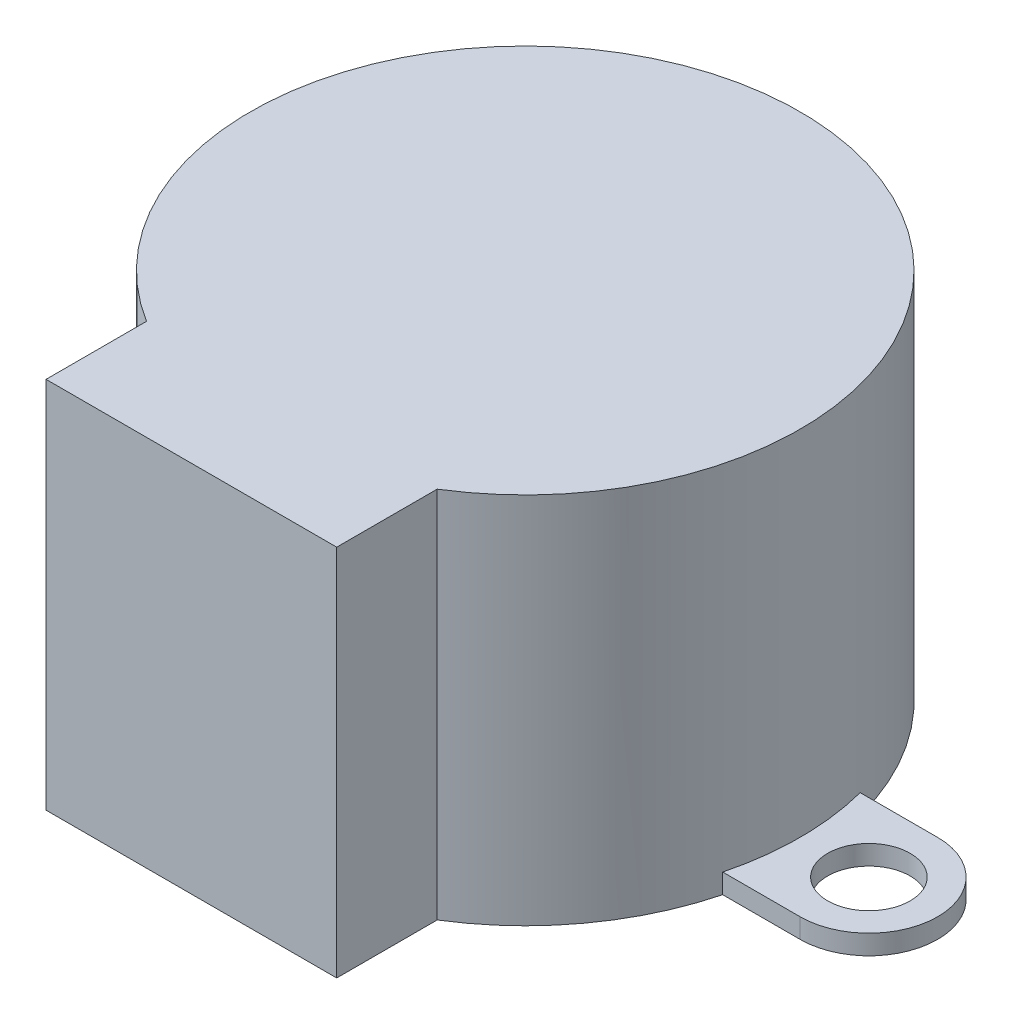
ISO-10303-21;
HEADER;
FILE_DESCRIPTION(('STEP AP214'),'2;1');
FILE_NAME('part.step','',(''),(''),'','','');
FILE_SCHEMA(('AUTOMOTIVE_DESIGN { 1 0 10303 214 1 1 1 1 }'));
ENDSEC;
DATA;
#1=APPLICATION_CONTEXT('core data for automotive mechanical design processes');
#2=APPLICATION_PROTOCOL_DEFINITION('international standard','automotive_design',2000,#1);
#3=PRODUCT_CONTEXT('',#1,'mechanical');
#4=PRODUCT('Part','Part','',(#3));
#5=PRODUCT_RELATED_PRODUCT_CATEGORY('part','',(#4));
#6=PRODUCT_DEFINITION_FORMATION('','',#4);
#7=PRODUCT_DEFINITION_CONTEXT('part definition',#1,'design');
#8=PRODUCT_DEFINITION('design','',#6,#7);
#9=PRODUCT_DEFINITION_SHAPE('','',#8);
#10=(LENGTH_UNIT() NAMED_UNIT(*) SI_UNIT(.MILLI.,.METRE.));
#11=(NAMED_UNIT(*) PLANE_ANGLE_UNIT() SI_UNIT($,.RADIAN.));
#12=(NAMED_UNIT(*) SI_UNIT($,.STERADIAN.) SOLID_ANGLE_UNIT());
#13=UNCERTAINTY_MEASURE_WITH_UNIT(LENGTH_MEASURE(1.E-05),#10,'distance_accuracy_value','');
#14=(GEOMETRIC_REPRESENTATION_CONTEXT(3) GLOBAL_UNCERTAINTY_ASSIGNED_CONTEXT((#13)) GLOBAL_UNIT_ASSIGNED_CONTEXT((#10,
#11,#12)) REPRESENTATION_CONTEXT('',''));
#15=CARTESIAN_POINT('',(0.,0.,0.));
#16=DIRECTION('',(0.,0.,1.));
#17=DIRECTION('',(1.,0.,0.));
#18=AXIS2_PLACEMENT_3D('',#15,#16,#17);
#19=CARTESIAN_POINT('',(0.,-4.,-8.));
#20=DIRECTION('',(0.,-1.,0.));
#21=DIRECTION('',(0.,0.,-1.));
#22=AXIS2_PLACEMENT_3D('',#19,#20,#21);
#23=PLANE('',#22);
#24=DIRECTION('',(0.,0.,-1.));
#25=VECTOR('',#24,1.);
#26=CARTESIAN_POINT('',(-1.5,-4.,-10.));
#27=LINE('',#26,#25);
#28=CARTESIAN_POINT('',(-1.5,-4.,-6.));
#29=VERTEX_POINT('',#28);
#30=CARTESIAN_POINT('',(-1.5,-4.,-10.));
#31=VERTEX_POINT('',#30);
#32=EDGE_CURVE('E52',#29,#31,#27,.T.);
#33=ORIENTED_EDGE('',*,*,#32,.F.);
#34=CARTESIAN_POINT('',(0.,-4.,-8.));
#35=DIRECTION('',(0.,-1.,0.));
#36=DIRECTION('',(0.,0.,-1.));
#37=AXIS2_PLACEMENT_3D('',#34,#35,#36);
#38=CIRCLE('',#37,2.5);
#39=EDGE_CURVE('E49',#29,#31,#38,.T.);
#40=ORIENTED_EDGE('',*,*,#39,.T.);
#41=EDGE_LOOP('',(#33,#40));
#42=FACE_BOUND('',#41,.T.);
#43=ADVANCED_FACE('F33',(#42),#23,.T.);
#44=CARTESIAN_POINT('',(0.,-1.5,-8.));
#45=DIRECTION('',(0.,-1.,0.));
#46=DIRECTION('',(0.,0.,-1.));
#47=AXIS2_PLACEMENT_3D('',#44,#45,#46);
#48=PLANE('',#47);
#49=CARTESIAN_POINT('',(0.,-1.5,-8.));
#50=DIRECTION('',(0.,-1.,0.));
#51=DIRECTION('',(0.,0.,-1.));
#52=AXIS2_PLACEMENT_3D('',#49,#50,#51);
#53=CIRCLE('',#52,4.5);
#54=CARTESIAN_POINT('',(0.,-1.5,-12.5));
#55=VERTEX_POINT('',#54);
#56=EDGE_CURVE('E191',#55,#55,#53,.T.);
#57=ORIENTED_EDGE('',*,*,#56,.T.);
#58=EDGE_LOOP('',(#57));
#59=FACE_BOUND('',#58,.T.);
#60=CARTESIAN_POINT('',(0.,-1.5,-8.));
#61=DIRECTION('',(0.,-1.,0.));
#62=DIRECTION('',(0.,0.,-1.));
#63=AXIS2_PLACEMENT_3D('',#60,#61,#62);
#64=CIRCLE('',#63,2.5);
#65=CARTESIAN_POINT('',(0.,-1.5,-10.5));
#66=VERTEX_POINT('',#65);
#67=EDGE_CURVE('E170',#66,#66,#64,.T.);
#68=ORIENTED_EDGE('',*,*,#67,.F.);
#69=EDGE_LOOP('',(#68));
#70=FACE_BOUND('',#69,.T.);
#71=ADVANCED_FACE('F319',(#59,#70),#48,.T.);
#72=CARTESIAN_POINT('',(0.,0.,0.));
#73=DIRECTION('',(0.,1.,0.));
#74=DIRECTION('',(0.,0.,1.));
#75=AXIS2_PLACEMENT_3D('',#72,#73,#74);
#76=PLANE('',#75);
#77=CARTESIAN_POINT('',(17.5,0.,0.));
#78=DIRECTION('',(0.,-1.,0.));
#79=DIRECTION('',(0.,0.,1.));
#80=AXIS2_PLACEMENT_3D('',#77,#78,#79);
#81=CIRCLE('',#80,2.1);
#82=CARTESIAN_POINT('',(17.5,0.,2.1));
#83=VERTEX_POINT('',#82);
#84=EDGE_CURVE('E194',#83,#83,#81,.T.);
#85=ORIENTED_EDGE('',*,*,#84,.F.);
#86=EDGE_LOOP('',(#85));
#87=FACE_BOUND('',#86,.T.);
#88=CARTESIAN_POINT('',(-17.5,0.,0.));
#89=DIRECTION('',(0.,-1.,0.));
#90=DIRECTION('',(0.,0.,-1.));
#91=AXIS2_PLACEMENT_3D('',#88,#89,#90);
#92=CIRCLE('',#91,2.1);
#93=CARTESIAN_POINT('',(-17.5,0.,-2.1));
#94=VERTEX_POINT('',#93);
#95=EDGE_CURVE('E221',#94,#94,#92,.T.);
#96=ORIENTED_EDGE('',*,*,#95,.F.);
#97=EDGE_LOOP('',(#96));
#98=FACE_BOUND('',#97,.T.);
#99=CARTESIAN_POINT('',(0.,0.,0.));
#100=DIRECTION('',(0.,1.,0.));
#101=DIRECTION('',(0.,0.,1.));
#102=AXIS2_PLACEMENT_3D('',#99,#100,#101);
#103=CIRCLE('',#102,14.);
#104=CARTESIAN_POINT('',(13.555441711726,0.,-3.5));
#105=VERTEX_POINT('',#104);
#106=CARTESIAN_POINT('',(-13.555441711726,0.,-3.5));
#107=VERTEX_POINT('',#106);
#108=EDGE_CURVE('E277',#105,#107,#103,.T.);
#109=ORIENTED_EDGE('',*,*,#108,.F.);
#110=DIRECTION('',(1.,0.,0.));
#111=VECTOR('',#110,1.);
#112=CARTESIAN_POINT('',(17.5,0.,-3.5));
#113=LINE('',#112,#111);
#114=CARTESIAN_POINT('',(17.5,0.,-3.5));
#115=VERTEX_POINT('',#114);
#116=EDGE_CURVE('E205',#105,#115,#113,.T.);
#117=ORIENTED_EDGE('',*,*,#116,.T.);
#118=CARTESIAN_POINT('',(17.5,0.,0.));
#119=DIRECTION('',(0.,-1.,0.));
#120=DIRECTION('',(0.,0.,1.));
#121=AXIS2_PLACEMENT_3D('',#118,#119,#120);
#122=CIRCLE('',#121,3.5);
#123=CARTESIAN_POINT('',(17.5,0.,3.5));
#124=VERTEX_POINT('',#123);
#125=EDGE_CURVE('E198',#115,#124,#122,.T.);
#126=ORIENTED_EDGE('',*,*,#125,.T.);
#127=DIRECTION('',(-1.,0.,0.));
#128=VECTOR('',#127,1.);
#129=CARTESIAN_POINT('',(17.5,0.,3.5));
#130=LINE('',#129,#128);
#131=CARTESIAN_POINT('',(13.555441711726,0.,3.5));
#132=VERTEX_POINT('',#131);
#133=EDGE_CURVE('E214',#124,#132,#130,.T.);
#134=ORIENTED_EDGE('',*,*,#133,.T.);
#135=CARTESIAN_POINT('',(7.4,0.,11.8844436133965));
#136=VERTEX_POINT('',#135);
#137=EDGE_CURVE('E274',#136,#132,#103,.T.);
#138=ORIENTED_EDGE('',*,*,#137,.F.);
#139=DIRECTION('',(0.,0.,-1.));
#140=VECTOR('',#139,1.);
#141=CARTESIAN_POINT('',(7.4,0.,17.));
#142=LINE('',#141,#140);
#143=CARTESIAN_POINT('',(7.4,0.,17.));
#144=VERTEX_POINT('',#143);
#145=EDGE_CURVE('E267',#144,#136,#142,.T.);
#146=ORIENTED_EDGE('',*,*,#145,.F.);
#147=DIRECTION('',(1.,0.,0.));
#148=VECTOR('',#147,1.);
#149=CARTESIAN_POINT('',(-7.4,0.,17.));
#150=LINE('',#149,#148);
#151=CARTESIAN_POINT('',(-7.4,0.,17.));
#152=VERTEX_POINT('',#151);
#153=EDGE_CURVE('E279',#152,#144,#150,.T.);
#154=ORIENTED_EDGE('',*,*,#153,.F.);
#155=DIRECTION('',(0.,0.,1.));
#156=VECTOR('',#155,1.);
#157=CARTESIAN_POINT('',(-7.4,0.,17.));
#158=LINE('',#157,#156);
#159=CARTESIAN_POINT('',(-7.4,0.,11.8844436133965));
#160=VERTEX_POINT('',#159);
#161=EDGE_CURVE('E276',#160,#152,#158,.T.);
#162=ORIENTED_EDGE('',*,*,#161,.F.);
#163=CARTESIAN_POINT('',(-13.555441711726,0.,3.5));
#164=VERTEX_POINT('',#163);
#165=EDGE_CURVE('E255',#164,#160,#103,.T.);
#166=ORIENTED_EDGE('',*,*,#165,.F.);
#167=DIRECTION('',(-1.,0.,0.));
#168=VECTOR('',#167,1.);
#169=CARTESIAN_POINT('',(-17.5,0.,3.5));
#170=LINE('',#169,#168);
#171=CARTESIAN_POINT('',(-17.5,0.,3.5));
#172=VERTEX_POINT('',#171);
#173=EDGE_CURVE('E239',#164,#172,#170,.T.);
#174=ORIENTED_EDGE('',*,*,#173,.T.);
#175=CARTESIAN_POINT('',(-17.5,0.,0.));
#176=DIRECTION('',(0.,-1.,0.));
#177=DIRECTION('',(0.,0.,-1.));
#178=AXIS2_PLACEMENT_3D('',#175,#176,#177);
#179=CIRCLE('',#178,3.5);
#180=CARTESIAN_POINT('',(-17.5,0.,-3.5));
#181=VERTEX_POINT('',#180);
#182=EDGE_CURVE('E232',#172,#181,#179,.T.);
#183=ORIENTED_EDGE('',*,*,#182,.T.);
#184=DIRECTION('',(1.,0.,0.));
#185=VECTOR('',#184,1.);
#186=CARTESIAN_POINT('',(-17.5,0.,-3.5));
#187=LINE('',#186,#185);
#188=EDGE_CURVE('E248',#181,#107,#187,.T.);
#189=ORIENTED_EDGE('',*,*,#188,.T.);
#190=EDGE_LOOP('',(#109,#117,#126,#134,#138,#146,#154,#162,#166,#174,#183,#189));
#191=FACE_BOUND('',#190,.T.);
#192=CARTESIAN_POINT('',(0.,0.,-8.));
#193=DIRECTION('',(0.,1.,0.));
#194=DIRECTION('',(0.,0.,1.));
#195=AXIS2_PLACEMENT_3D('',#192,#193,#194);
#196=CIRCLE('',#195,4.5);
#197=CARTESIAN_POINT('',(0.,0.,-3.5));
#198=VERTEX_POINT('',#197);
#199=EDGE_CURVE('E11',#198,#198,#196,.F.);
#200=ORIENTED_EDGE('',*,*,#199,.F.);
#201=EDGE_LOOP('',(#200));
#202=FACE_BOUND('',#201,.T.);
#203=ADVANCED_FACE('F324',(#87,#98,#191,#202),#76,.F.);
#204=CARTESIAN_POINT('',(0.,19.,0.));
#205=DIRECTION('',(0.,-1.,0.));
#206=DIRECTION('',(0.,0.,-1.));
#207=AXIS2_PLACEMENT_3D('',#204,#205,#206);
#208=CYLINDRICAL_SURFACE('',#207,14.);
#209=CARTESIAN_POINT('',(0.,1.,0.));
#210=DIRECTION('',(0.,1.,0.));
#211=DIRECTION('',(0.,0.,1.));
#212=AXIS2_PLACEMENT_3D('',#209,#210,#211);
#213=CIRCLE('',#212,14.);
#214=CARTESIAN_POINT('',(13.555441711726,1.,3.5));
#215=VERTEX_POINT('',#214);
#216=CARTESIAN_POINT('',(13.555441711726,1.,-3.50000000000002));
#217=VERTEX_POINT('',#216);
#218=EDGE_CURVE('E42',#215,#217,#213,.T.);
#219=ORIENTED_EDGE('',*,*,#218,.T.);
#220=DIRECTION('',(0.,-1.,0.));
#221=VECTOR('',#220,1.);
#222=CARTESIAN_POINT('',(13.555441711726,1.,-3.5));
#223=LINE('',#222,#221);
#224=EDGE_CURVE('E222',#217,#105,#223,.T.);
#225=ORIENTED_EDGE('',*,*,#224,.T.);
#226=ORIENTED_EDGE('',*,*,#108,.T.);
#227=DIRECTION('',(0.,-1.,0.));
#228=VECTOR('',#227,1.);
#229=CARTESIAN_POINT('',(-13.555441711726,1.,-3.5));
#230=LINE('',#229,#228);
#231=CARTESIAN_POINT('',(-13.555441711726,1.,-3.5));
#232=VERTEX_POINT('',#231);
#233=EDGE_CURVE('E259',#232,#107,#230,.T.);
#234=ORIENTED_EDGE('',*,*,#233,.F.);
#235=CARTESIAN_POINT('',(0.,1.,0.));
#236=DIRECTION('',(0.,-1.,0.));
#237=DIRECTION('',(0.,0.,-1.));
#238=AXIS2_PLACEMENT_3D('',#235,#236,#237);
#239=CIRCLE('',#238,14.);
#240=CARTESIAN_POINT('',(-13.555441711726,1.,3.5));
#241=VERTEX_POINT('',#240);
#242=EDGE_CURVE('E293',#241,#232,#239,.T.);
#243=ORIENTED_EDGE('',*,*,#242,.F.);
#244=DIRECTION('',(0.,-1.,0.));
#245=VECTOR('',#244,1.);
#246=CARTESIAN_POINT('',(-13.555441711726,1.,3.5));
#247=LINE('',#246,#245);
#248=EDGE_CURVE('E256',#241,#164,#247,.T.);
#249=ORIENTED_EDGE('',*,*,#248,.T.);
#250=ORIENTED_EDGE('',*,*,#165,.T.);
#251=DIRECTION('',(0.,-1.,0.));
#252=VECTOR('',#251,1.);
#253=CARTESIAN_POINT('',(-7.4,19.,11.8844436133965));
#254=LINE('',#253,#252);
#255=CARTESIAN_POINT('',(-7.4,19.,11.8844436133965));
#256=VERTEX_POINT('',#255);
#257=EDGE_CURVE('E290',#256,#160,#254,.T.);
#258=ORIENTED_EDGE('',*,*,#257,.F.);
#259=CARTESIAN_POINT('',(0.,19.,0.));
#260=DIRECTION('',(0.,1.,0.));
#261=DIRECTION('',(0.,0.,1.));
#262=AXIS2_PLACEMENT_3D('',#259,#260,#261);
#263=CIRCLE('',#262,14.);
#264=CARTESIAN_POINT('',(7.4,19.,11.8844436133965));
#265=VERTEX_POINT('',#264);
#266=EDGE_CURVE('E263',#265,#256,#263,.T.);
#267=ORIENTED_EDGE('',*,*,#266,.F.);
#268=DIRECTION('',(0.,-1.,0.));
#269=VECTOR('',#268,1.);
#270=CARTESIAN_POINT('',(7.4,19.,11.8844436133965));
#271=LINE('',#270,#269);
#272=EDGE_CURVE('E273',#265,#136,#271,.T.);
#273=ORIENTED_EDGE('',*,*,#272,.T.);
#274=ORIENTED_EDGE('',*,*,#137,.T.);
#275=DIRECTION('',(0.,-1.,0.));
#276=VECTOR('',#275,1.);
#277=CARTESIAN_POINT('',(13.555441711726,1.,3.5));
#278=LINE('',#277,#276);
#279=EDGE_CURVE('E225',#215,#132,#278,.T.);
#280=ORIENTED_EDGE('',*,*,#279,.F.);
#281=EDGE_LOOP('',(#219,#225,#226,#234,#243,#249,#250,#258,#267,#273,#274,#280));
#282=FACE_BOUND('',#281,.T.);
#283=ADVANCED_FACE('F35',(#282),#208,.T.);
#284=CARTESIAN_POINT('',(-7.4,19.,17.));
#285=DIRECTION('',(1.,0.,0.));
#286=DIRECTION('',(0.,0.,-1.));
#287=AXIS2_PLACEMENT_3D('',#284,#285,#286);
#288=PLANE('',#287);
#289=ORIENTED_EDGE('',*,*,#161,.T.);
#290=DIRECTION('',(0.,-1.,0.));
#291=VECTOR('',#290,1.);
#292=CARTESIAN_POINT('',(-7.4,19.,17.));
#293=LINE('',#292,#291);
#294=CARTESIAN_POINT('',(-7.4,19.,17.));
#295=VERTEX_POINT('',#294);
#296=EDGE_CURVE('E287',#295,#152,#293,.T.);
#297=ORIENTED_EDGE('',*,*,#296,.F.);
#298=DIRECTION('',(0.,0.,1.));
#299=VECTOR('',#298,1.);
#300=CARTESIAN_POINT('',(-7.4,19.,17.));
#301=LINE('',#300,#299);
#302=EDGE_CURVE('E266',#256,#295,#301,.T.);
#303=ORIENTED_EDGE('',*,*,#302,.F.);
#304=ORIENTED_EDGE('',*,*,#257,.T.);
#305=EDGE_LOOP('',(#289,#297,#303,#304));
#306=FACE_BOUND('',#305,.T.);
#307=ADVANCED_FACE('F392',(#306),#288,.F.);
#308=CARTESIAN_POINT('',(-7.4,19.,17.));
#309=DIRECTION('',(0.,0.,-1.));
#310=DIRECTION('',(-1.,0.,0.));
#311=AXIS2_PLACEMENT_3D('',#308,#309,#310);
#312=PLANE('',#311);
#313=ORIENTED_EDGE('',*,*,#153,.T.);
#314=DIRECTION('',(0.,-1.,0.));
#315=VECTOR('',#314,1.);
#316=CARTESIAN_POINT('',(7.4,19.,17.));
#317=LINE('',#316,#315);
#318=CARTESIAN_POINT('',(7.4,19.,17.));
#319=VERTEX_POINT('',#318);
#320=EDGE_CURVE('E284',#319,#144,#317,.T.);
#321=ORIENTED_EDGE('',*,*,#320,.F.);
#322=DIRECTION('',(1.,0.,0.));
#323=VECTOR('',#322,1.);
#324=CARTESIAN_POINT('',(-7.4,19.,17.));
#325=LINE('',#324,#323);
#326=EDGE_CURVE('E269',#295,#319,#325,.T.);
#327=ORIENTED_EDGE('',*,*,#326,.F.);
#328=ORIENTED_EDGE('',*,*,#296,.T.);
#329=EDGE_LOOP('',(#313,#321,#327,#328));
#330=FACE_BOUND('',#329,.T.);
#331=ADVANCED_FACE('F389',(#330),#312,.F.);
#332=CARTESIAN_POINT('',(7.4,19.,17.));
#333=DIRECTION('',(-1.,0.,0.));
#334=DIRECTION('',(0.,0.,1.));
#335=AXIS2_PLACEMENT_3D('',#332,#333,#334);
#336=PLANE('',#335);
#337=ORIENTED_EDGE('',*,*,#145,.T.);
#338=ORIENTED_EDGE('',*,*,#272,.F.);
#339=DIRECTION('',(0.,0.,-1.));
#340=VECTOR('',#339,1.);
#341=CARTESIAN_POINT('',(7.4,19.,17.));
#342=LINE('',#341,#340);
#343=EDGE_CURVE('E271',#319,#265,#342,.T.);
#344=ORIENTED_EDGE('',*,*,#343,.F.);
#345=ORIENTED_EDGE('',*,*,#320,.T.);
#346=EDGE_LOOP('',(#337,#338,#344,#345));
#347=FACE_BOUND('',#346,.T.);
#348=ADVANCED_FACE('F382',(#347),#336,.F.);
#349=CARTESIAN_POINT('',(0.,19.,0.));
#350=DIRECTION('',(0.,1.,0.));
#351=DIRECTION('',(0.,0.,1.));
#352=AXIS2_PLACEMENT_3D('',#349,#350,#351);
#353=PLANE('',#352);
#354=ORIENTED_EDGE('',*,*,#266,.T.);
#355=ORIENTED_EDGE('',*,*,#302,.T.);
#356=ORIENTED_EDGE('',*,*,#326,.T.);
#357=ORIENTED_EDGE('',*,*,#343,.T.);
#358=EDGE_LOOP('',(#354,#355,#356,#357));
#359=FACE_BOUND('',#358,.T.);
#360=ADVANCED_FACE('F368',(#359),#353,.T.);
#361=CARTESIAN_POINT('',(-17.5,1.,0.));
#362=DIRECTION('',(0.,-1.,0.));
#363=DIRECTION('',(0.,0.,-1.));
#364=AXIS2_PLACEMENT_3D('',#361,#362,#363);
#365=PLANE('',#364);
#366=CARTESIAN_POINT('',(-17.5,1.,0.));
#367=DIRECTION('',(0.,-1.,0.));
#368=DIRECTION('',(0.,0.,-1.));
#369=AXIS2_PLACEMENT_3D('',#366,#367,#368);
#370=CIRCLE('',#369,2.1);
#371=CARTESIAN_POINT('',(-17.5,1.,-2.1));
#372=VERTEX_POINT('',#371);
#373=EDGE_CURVE('E229',#372,#372,#370,.T.);
#374=ORIENTED_EDGE('',*,*,#373,.T.);
#375=EDGE_LOOP('',(#374));
#376=FACE_BOUND('',#375,.T.);
#377=DIRECTION('',(-1.,0.,0.));
#378=VECTOR('',#377,1.);
#379=CARTESIAN_POINT('',(-17.5,1.,3.5));
#380=LINE('',#379,#378);
#381=CARTESIAN_POINT('',(-17.5,1.,3.5));
#382=VERTEX_POINT('',#381);
#383=EDGE_CURVE('E242',#241,#382,#380,.T.);
#384=ORIENTED_EDGE('',*,*,#383,.F.);
#385=ORIENTED_EDGE('',*,*,#242,.T.);
#386=DIRECTION('',(1.,0.,0.));
#387=VECTOR('',#386,1.);
#388=CARTESIAN_POINT('',(-17.5,1.,-3.5));
#389=LINE('',#388,#387);
#390=CARTESIAN_POINT('',(-17.5,1.,-3.5));
#391=VERTEX_POINT('',#390);
#392=EDGE_CURVE('E238',#391,#232,#389,.T.);
#393=ORIENTED_EDGE('',*,*,#392,.F.);
#394=CARTESIAN_POINT('',(-17.5,1.,0.));
#395=DIRECTION('',(0.,-1.,0.));
#396=DIRECTION('',(0.,0.,-1.));
#397=AXIS2_PLACEMENT_3D('',#394,#395,#396);
#398=CIRCLE('',#397,3.5);
#399=EDGE_CURVE('E235',#382,#391,#398,.T.);
#400=ORIENTED_EDGE('',*,*,#399,.F.);
#401=EDGE_LOOP('',(#384,#385,#393,#400));
#402=FACE_BOUND('',#401,.T.);
#403=ADVANCED_FACE('F364',(#376,#402),#365,.F.);
#404=CARTESIAN_POINT('',(-17.5,1.,0.));
#405=DIRECTION('',(0.,-1.,0.));
#406=DIRECTION('',(0.,0.,-1.));
#407=AXIS2_PLACEMENT_3D('',#404,#405,#406);
#408=CYLINDRICAL_SURFACE('',#407,3.5);
#409=ORIENTED_EDGE('',*,*,#182,.F.);
#410=DIRECTION('',(0.,-1.,0.));
#411=VECTOR('',#410,1.);
#412=CARTESIAN_POINT('',(-17.5,1.,3.5));
#413=LINE('',#412,#411);
#414=EDGE_CURVE('E253',#382,#172,#413,.T.);
#415=ORIENTED_EDGE('',*,*,#414,.F.);
#416=ORIENTED_EDGE('',*,*,#399,.T.);
#417=DIRECTION('',(0.,-1.,0.));
#418=VECTOR('',#417,1.);
#419=CARTESIAN_POINT('',(-17.5,1.,-3.5));
#420=LINE('',#419,#418);
#421=EDGE_CURVE('E245',#391,#181,#420,.T.);
#422=ORIENTED_EDGE('',*,*,#421,.T.);
#423=EDGE_LOOP('',(#409,#415,#416,#422));
#424=FACE_BOUND('',#423,.T.);
#425=ADVANCED_FACE('F367',(#424),#408,.T.);
#426=CARTESIAN_POINT('',(-17.5,1.,3.5));
#427=DIRECTION('',(0.,0.,1.));
#428=DIRECTION('',(1.,0.,0.));
#429=AXIS2_PLACEMENT_3D('',#426,#427,#428);
#430=PLANE('',#429);
#431=ORIENTED_EDGE('',*,*,#173,.F.);
#432=ORIENTED_EDGE('',*,*,#248,.F.);
#433=ORIENTED_EDGE('',*,*,#383,.T.);
#434=ORIENTED_EDGE('',*,*,#414,.T.);
#435=EDGE_LOOP('',(#431,#432,#433,#434));
#436=FACE_BOUND('',#435,.T.);
#437=ADVANCED_FACE('F370',(#436),#430,.T.);
#438=CARTESIAN_POINT('',(-17.5,1.,-3.5));
#439=DIRECTION('',(0.,0.,-1.));
#440=DIRECTION('',(-1.,0.,0.));
#441=AXIS2_PLACEMENT_3D('',#438,#439,#440);
#442=PLANE('',#441);
#443=ORIENTED_EDGE('',*,*,#188,.F.);
#444=ORIENTED_EDGE('',*,*,#421,.F.);
#445=ORIENTED_EDGE('',*,*,#392,.T.);
#446=ORIENTED_EDGE('',*,*,#233,.T.);
#447=EDGE_LOOP('',(#443,#444,#445,#446));
#448=FACE_BOUND('',#447,.T.);
#449=ADVANCED_FACE('F362',(#448),#442,.T.);
#450=CARTESIAN_POINT('',(-17.5,1.,0.));
#451=DIRECTION('',(0.,-1.,0.));
#452=DIRECTION('',(0.,0.,-1.));
#453=AXIS2_PLACEMENT_3D('',#450,#451,#452);
#454=CYLINDRICAL_SURFACE('',#453,2.1);
#455=ORIENTED_EDGE('',*,*,#373,.F.);
#456=EDGE_LOOP('',(#455));
#457=FACE_BOUND('',#456,.T.);
#458=ORIENTED_EDGE('',*,*,#95,.T.);
#459=EDGE_LOOP('',(#458));
#460=FACE_BOUND('',#459,.T.);
#461=ADVANCED_FACE('F348',(#457,#460),#454,.F.);
#462=CARTESIAN_POINT('',(17.5,1.,0.));
#463=DIRECTION('',(0.,1.,0.));
#464=DIRECTION('',(0.,0.,1.));
#465=AXIS2_PLACEMENT_3D('',#462,#463,#464);
#466=PLANE('',#465);
#467=CARTESIAN_POINT('',(17.5,1.,0.));
#468=DIRECTION('',(0.,-1.,0.));
#469=DIRECTION('',(0.,0.,1.));
#470=AXIS2_PLACEMENT_3D('',#467,#468,#469);
#471=CIRCLE('',#470,2.1);
#472=CARTESIAN_POINT('',(17.5,1.,2.1));
#473=VERTEX_POINT('',#472);
#474=EDGE_CURVE('E195',#473,#473,#471,.T.);
#475=ORIENTED_EDGE('',*,*,#474,.T.);
#476=EDGE_LOOP('',(#475));
#477=FACE_BOUND('',#476,.T.);
#478=ORIENTED_EDGE('',*,*,#218,.F.);
#479=DIRECTION('',(-1.,0.,0.));
#480=VECTOR('',#479,1.);
#481=CARTESIAN_POINT('',(17.5,1.,3.5));
#482=LINE('',#481,#480);
#483=CARTESIAN_POINT('',(17.5,1.,3.5));
#484=VERTEX_POINT('',#483);
#485=EDGE_CURVE('E204',#484,#215,#482,.T.);
#486=ORIENTED_EDGE('',*,*,#485,.F.);
#487=CARTESIAN_POINT('',(17.5,1.,0.));
#488=DIRECTION('',(0.,-1.,0.));
#489=DIRECTION('',(0.,0.,1.));
#490=AXIS2_PLACEMENT_3D('',#487,#488,#489);
#491=CIRCLE('',#490,3.5);
#492=CARTESIAN_POINT('',(17.5,1.,-3.5));
#493=VERTEX_POINT('',#492);
#494=EDGE_CURVE('E201',#493,#484,#491,.T.);
#495=ORIENTED_EDGE('',*,*,#494,.F.);
#496=DIRECTION('',(1.,0.,0.));
#497=VECTOR('',#496,1.);
#498=CARTESIAN_POINT('',(17.5,1.,-3.5));
#499=LINE('',#498,#497);
#500=EDGE_CURVE('E208',#217,#493,#499,.T.);
#501=ORIENTED_EDGE('',*,*,#500,.F.);
#502=EDGE_LOOP('',(#478,#486,#495,#501));
#503=FACE_BOUND('',#502,.T.);
#504=ADVANCED_FACE('F344',(#477,#503),#466,.T.);
#505=CARTESIAN_POINT('',(17.5,1.,0.));
#506=DIRECTION('',(0.,-1.,0.));
#507=DIRECTION('',(0.,0.,-1.));
#508=AXIS2_PLACEMENT_3D('',#505,#506,#507);
#509=CYLINDRICAL_SURFACE('',#508,3.5);
#510=ORIENTED_EDGE('',*,*,#125,.F.);
#511=DIRECTION('',(0.,-1.,0.));
#512=VECTOR('',#511,1.);
#513=CARTESIAN_POINT('',(17.5,1.,-3.5));
#514=LINE('',#513,#512);
#515=EDGE_CURVE('E219',#493,#115,#514,.T.);
#516=ORIENTED_EDGE('',*,*,#515,.F.);
#517=ORIENTED_EDGE('',*,*,#494,.T.);
#518=DIRECTION('',(0.,-1.,0.));
#519=VECTOR('',#518,1.);
#520=CARTESIAN_POINT('',(17.5,1.,3.5));
#521=LINE('',#520,#519);
#522=EDGE_CURVE('E211',#484,#124,#521,.T.);
#523=ORIENTED_EDGE('',*,*,#522,.T.);
#524=EDGE_LOOP('',(#510,#516,#517,#523));
#525=FACE_BOUND('',#524,.T.);
#526=ADVANCED_FACE('F347',(#525),#509,.T.);
#527=CARTESIAN_POINT('',(17.5,1.,-3.5));
#528=DIRECTION('',(0.,0.,-1.));
#529=DIRECTION('',(-1.,0.,0.));
#530=AXIS2_PLACEMENT_3D('',#527,#528,#529);
#531=PLANE('',#530);
#532=ORIENTED_EDGE('',*,*,#116,.F.);
#533=ORIENTED_EDGE('',*,*,#224,.F.);
#534=ORIENTED_EDGE('',*,*,#500,.T.);
#535=ORIENTED_EDGE('',*,*,#515,.T.);
#536=EDGE_LOOP('',(#532,#533,#534,#535));
#537=FACE_BOUND('',#536,.T.);
#538=ADVANCED_FACE('F350',(#537),#531,.T.);
#539=CARTESIAN_POINT('',(17.5,1.,3.5));
#540=DIRECTION('',(0.,0.,1.));
#541=DIRECTION('',(1.,0.,0.));
#542=AXIS2_PLACEMENT_3D('',#539,#540,#541);
#543=PLANE('',#542);
#544=ORIENTED_EDGE('',*,*,#133,.F.);
#545=ORIENTED_EDGE('',*,*,#522,.F.);
#546=ORIENTED_EDGE('',*,*,#485,.T.);
#547=ORIENTED_EDGE('',*,*,#279,.T.);
#548=EDGE_LOOP('',(#544,#545,#546,#547));
#549=FACE_BOUND('',#548,.T.);
#550=ADVANCED_FACE('F342',(#549),#543,.T.);
#551=CARTESIAN_POINT('',(17.5,1.,0.));
#552=DIRECTION('',(0.,-1.,0.));
#553=DIRECTION('',(0.,0.,-1.));
#554=AXIS2_PLACEMENT_3D('',#551,#552,#553);
#555=CYLINDRICAL_SURFACE('',#554,2.1);
#556=ORIENTED_EDGE('',*,*,#474,.F.);
#557=EDGE_LOOP('',(#556));
#558=FACE_BOUND('',#557,.T.);
#559=ORIENTED_EDGE('',*,*,#84,.T.);
#560=EDGE_LOOP('',(#559));
#561=FACE_BOUND('',#560,.T.);
#562=ADVANCED_FACE('F336',(#558,#561),#555,.F.);
#563=CARTESIAN_POINT('',(0.,-1.5,-8.));
#564=DIRECTION('',(0.,1.,0.));
#565=DIRECTION('',(0.,0.,1.));
#566=AXIS2_PLACEMENT_3D('',#563,#564,#565);
#567=CYLINDRICAL_SURFACE('',#566,4.5);
#568=ORIENTED_EDGE('',*,*,#56,.F.);
#569=EDGE_LOOP('',(#568));
#570=FACE_BOUND('',#569,.T.);
#571=ORIENTED_EDGE('',*,*,#199,.T.);
#572=EDGE_LOOP('',(#571));
#573=FACE_BOUND('',#572,.T.);
#574=ADVANCED_FACE('F332',(#570,#573),#567,.T.);
#575=CARTESIAN_POINT('',(0.,-4.,-8.));
#576=DIRECTION('',(0.,1.,0.));
#577=DIRECTION('',(0.,0.,1.));
#578=AXIS2_PLACEMENT_3D('',#575,#576,#577);
#579=CYLINDRICAL_SURFACE('',#578,2.5);
#580=CARTESIAN_POINT('',(1.5,-4.,-10.));
#581=VERTEX_POINT('',#580);
#582=CARTESIAN_POINT('',(1.5,-4.,-6.));
#583=VERTEX_POINT('',#582);
#584=EDGE_CURVE('E169',#581,#583,#38,.T.);
#585=ORIENTED_EDGE('',*,*,#584,.F.);
#586=DIRECTION('',(0.,1.,0.));
#587=VECTOR('',#586,1.);
#588=CARTESIAN_POINT('',(1.5,-10.,-10.));
#589=LINE('',#588,#587);
#590=CARTESIAN_POINT('',(1.5,-10.,-10.));
#591=VERTEX_POINT('',#590);
#592=EDGE_CURVE('E150',#591,#581,#589,.T.);
#593=ORIENTED_EDGE('',*,*,#592,.F.);
#594=CARTESIAN_POINT('',(0.,-10.,-8.));
#595=DIRECTION('',(0.,-1.,0.));
#596=DIRECTION('',(0.,0.,-1.));
#597=AXIS2_PLACEMENT_3D('',#594,#595,#596);
#598=CIRCLE('',#597,2.5);
#599=CARTESIAN_POINT('',(-1.5,-10.,-10.));
#600=VERTEX_POINT('',#599);
#601=EDGE_CURVE('E156',#600,#591,#598,.T.);
#602=ORIENTED_EDGE('',*,*,#601,.F.);
#603=DIRECTION('',(0.,1.,0.));
#604=VECTOR('',#603,1.);
#605=CARTESIAN_POINT('',(-1.5,-10.,-10.));
#606=LINE('',#605,#604);
#607=EDGE_CURVE('E184',#600,#31,#606,.T.);
#608=ORIENTED_EDGE('',*,*,#607,.T.);
#609=ORIENTED_EDGE('',*,*,#39,.F.);
#610=DIRECTION('',(0.,1.,0.));
#611=VECTOR('',#610,1.);
#612=CARTESIAN_POINT('',(-1.5,-10.,-6.));
#613=LINE('',#612,#611);
#614=CARTESIAN_POINT('',(-1.5,-10.,-6.));
#615=VERTEX_POINT('',#614);
#616=EDGE_CURVE('E174',#615,#29,#613,.T.);
#617=ORIENTED_EDGE('',*,*,#616,.F.);
#618=CARTESIAN_POINT('',(0.,-10.,-8.));
#619=DIRECTION('',(0.,-1.,0.));
#620=DIRECTION('',(0.,0.,-1.));
#621=AXIS2_PLACEMENT_3D('',#618,#619,#620);
#622=CIRCLE('',#621,2.5);
#623=CARTESIAN_POINT('',(1.5,-10.,-6.));
#624=VERTEX_POINT('',#623);
#625=EDGE_CURVE('E155',#624,#615,#622,.T.);
#626=ORIENTED_EDGE('',*,*,#625,.F.);
#627=DIRECTION('',(0.,1.,0.));
#628=VECTOR('',#627,1.);
#629=CARTESIAN_POINT('',(1.5,-10.,-6.));
#630=LINE('',#629,#628);
#631=EDGE_CURVE('E152',#624,#583,#630,.T.);
#632=ORIENTED_EDGE('',*,*,#631,.T.);
#633=EDGE_LOOP('',(#585,#593,#602,#608,#609,#617,#626,#632));
#634=FACE_BOUND('',#633,.T.);
#635=ORIENTED_EDGE('',*,*,#67,.T.);
#636=EDGE_LOOP('',(#635));
#637=FACE_BOUND('',#636,.T.);
#638=ADVANCED_FACE('F167',(#634,#637),#579,.T.);
#639=DIRECTION('',(0.,0.,1.));
#640=VECTOR('',#639,1.);
#641=CARTESIAN_POINT('',(1.5,-4.,-10.));
#642=LINE('',#641,#640);
#643=EDGE_CURVE('E183',#581,#583,#642,.T.);
#644=ORIENTED_EDGE('',*,*,#643,.F.);
#645=ORIENTED_EDGE('',*,*,#584,.T.);
#646=EDGE_LOOP('',(#644,#645));
#647=FACE_BOUND('',#646,.T.);
#648=ADVANCED_FACE('F316',(#647),#23,.T.);
#649=CARTESIAN_POINT('',(1.5,-10.,-10.));
#650=DIRECTION('',(-1.,0.,0.));
#651=DIRECTION('',(0.,0.,1.));
#652=AXIS2_PLACEMENT_3D('',#649,#650,#651);
#653=PLANE('',#652);
#654=ORIENTED_EDGE('',*,*,#643,.T.);
#655=ORIENTED_EDGE('',*,*,#631,.F.);
#656=DIRECTION('',(0.,0.,1.));
#657=VECTOR('',#656,1.);
#658=CARTESIAN_POINT('',(1.5,-10.,-10.));
#659=LINE('',#658,#657);
#660=EDGE_CURVE('E145',#591,#624,#659,.T.);
#661=ORIENTED_EDGE('',*,*,#660,.F.);
#662=ORIENTED_EDGE('',*,*,#592,.T.);
#663=EDGE_LOOP('',(#654,#655,#661,#662));
#664=FACE_BOUND('',#663,.T.);
#665=ADVANCED_FACE('F148',(#664),#653,.F.);
#666=CARTESIAN_POINT('',(-1.5,-10.,-10.));
#667=DIRECTION('',(1.,0.,0.));
#668=DIRECTION('',(0.,0.,-1.));
#669=AXIS2_PLACEMENT_3D('',#666,#667,#668);
#670=PLANE('',#669);
#671=ORIENTED_EDGE('',*,*,#32,.T.);
#672=ORIENTED_EDGE('',*,*,#607,.F.);
#673=DIRECTION('',(0.,0.,-1.));
#674=VECTOR('',#673,1.);
#675=CARTESIAN_POINT('',(-1.5,-10.,-10.));
#676=LINE('',#675,#674);
#677=EDGE_CURVE('E161',#615,#600,#676,.T.);
#678=ORIENTED_EDGE('',*,*,#677,.F.);
#679=ORIENTED_EDGE('',*,*,#616,.T.);
#680=EDGE_LOOP('',(#671,#672,#678,#679));
#681=FACE_BOUND('',#680,.T.);
#682=ADVANCED_FACE('F308',(#681),#670,.F.);
#683=CARTESIAN_POINT('',(0.,-10.,-8.));
#684=DIRECTION('',(0.,-1.,0.));
#685=DIRECTION('',(0.,0.,-1.));
#686=AXIS2_PLACEMENT_3D('',#683,#684,#685);
#687=PLANE('',#686);
#688=ORIENTED_EDGE('',*,*,#601,.T.);
#689=ORIENTED_EDGE('',*,*,#660,.T.);
#690=ORIENTED_EDGE('',*,*,#625,.T.);
#691=ORIENTED_EDGE('',*,*,#677,.T.);
#692=EDGE_LOOP('',(#688,#689,#690,#691));
#693=FACE_BOUND('',#692,.T.);
#694=ADVANCED_FACE('F159',(#693),#687,.T.);
#695=CLOSED_SHELL('',(#43,#71,#203,#283,#307,#331,#348,#360,#403,#425,#437,#449,#461,#504,#526,
#538,#550,#562,#574,#638,#648,#665,#682,#694));
#696=MANIFOLD_SOLID_BREP('B2',#695);
#697=ADVANCED_BREP_SHAPE_REPRESENTATION('',(#18,#696),#14);
#698=SHAPE_DEFINITION_REPRESENTATION(#9,#697);
ENDSEC;
END-ISO-10303-21;
